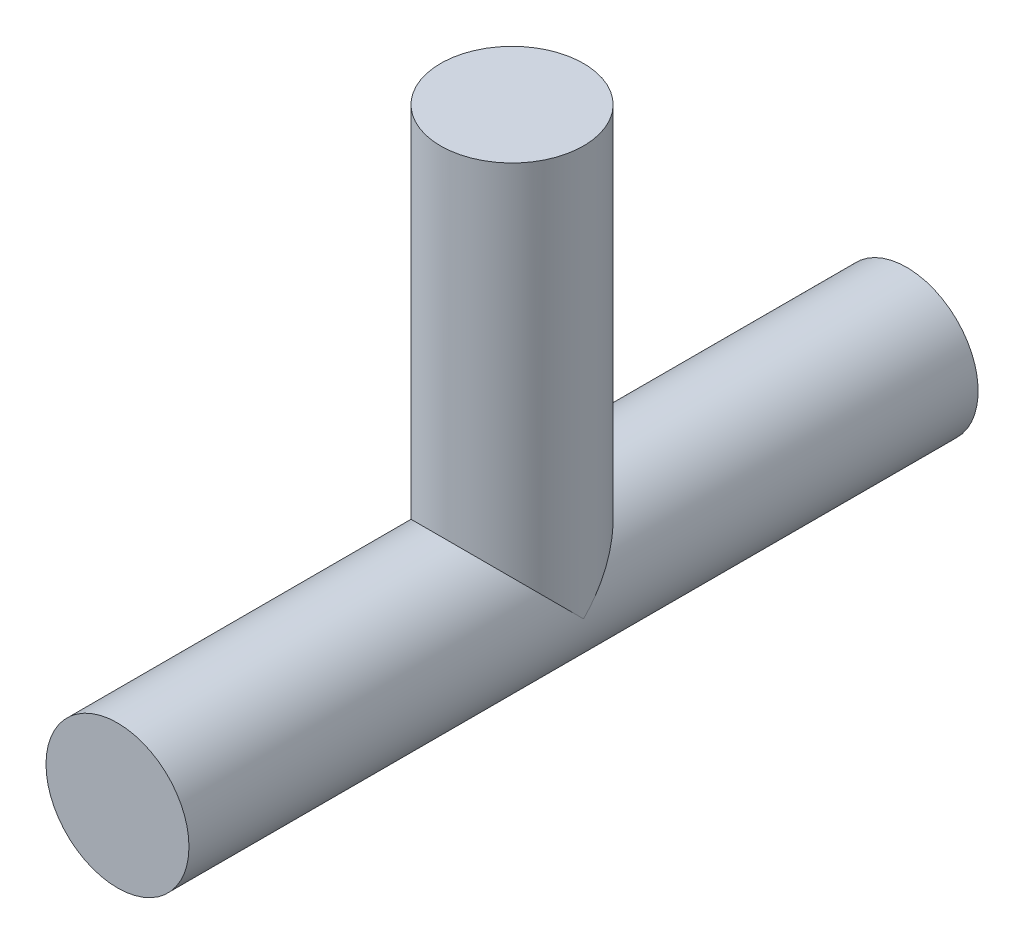
ISO-10303-21;
HEADER;
FILE_DESCRIPTION(('STEP AP214'),'2;1');
FILE_NAME('part.step','',(''),(''),'','','');
FILE_SCHEMA(('AUTOMOTIVE_DESIGN { 1 0 10303 214 1 1 1 1 }'));
ENDSEC;
DATA;
#1=APPLICATION_CONTEXT('core data for automotive mechanical design processes');
#2=APPLICATION_PROTOCOL_DEFINITION('international standard','automotive_design',2000,#1);
#3=PRODUCT_CONTEXT('',#1,'mechanical');
#4=PRODUCT('Part','Part','',(#3));
#5=PRODUCT_RELATED_PRODUCT_CATEGORY('part','',(#4));
#6=PRODUCT_DEFINITION_FORMATION('','',#4);
#7=PRODUCT_DEFINITION_CONTEXT('part definition',#1,'design');
#8=PRODUCT_DEFINITION('design','',#6,#7);
#9=PRODUCT_DEFINITION_SHAPE('','',#8);
#10=(LENGTH_UNIT() NAMED_UNIT(*) SI_UNIT(.MILLI.,.METRE.));
#11=(NAMED_UNIT(*) PLANE_ANGLE_UNIT() SI_UNIT($,.RADIAN.));
#12=(NAMED_UNIT(*) SI_UNIT($,.STERADIAN.) SOLID_ANGLE_UNIT());
#13=UNCERTAINTY_MEASURE_WITH_UNIT(LENGTH_MEASURE(1.E-05),#10,'distance_accuracy_value','');
#14=(GEOMETRIC_REPRESENTATION_CONTEXT(3) GLOBAL_UNCERTAINTY_ASSIGNED_CONTEXT((#13)) GLOBAL_UNIT_ASSIGNED_CONTEXT((#10,
#11,#12)) REPRESENTATION_CONTEXT('',''));
#15=CARTESIAN_POINT('',(0.,0.,0.));
#16=DIRECTION('',(0.,0.,1.));
#17=DIRECTION('',(1.,0.,0.));
#18=AXIS2_PLACEMENT_3D('',#15,#16,#17);
#19=CARTESIAN_POINT('',(-1.19117193968114E-06,55.0773866766543,2.03268499893037E-07));
#20=DIRECTION('',(0.,1.,0.));
#21=DIRECTION('',(0.,0.,1.));
#22=AXIS2_PLACEMENT_3D('',#19,#20,#21);
#23=PLANE('',#22);
#24=CARTESIAN_POINT('',(-1.19117193968114E-06,55.0773866766543,2.03268499893037E-07));
#25=DIRECTION('',(0.,1.,0.));
#26=DIRECTION('',(0.,0.,1.));
#27=AXIS2_PLACEMENT_3D('',#24,#25,#26);
#28=CIRCLE('',#27,9.625);
#29=CARTESIAN_POINT('',(-1.19117193968114E-06,55.0773866766543,9.6250002032685));
#30=VERTEX_POINT('',#29);
#31=EDGE_CURVE('E41',#30,#30,#28,.T.);
#32=ORIENTED_EDGE('',*,*,#31,.T.);
#33=EDGE_LOOP('',(#32));
#34=FACE_BOUND('',#33,.T.);
#35=ADVANCED_FACE('F38',(#34),#23,.T.);
#36=CARTESIAN_POINT('',(-1.19117193968114E-06,-0.0726133233457455,-53.1299997967315));
#37=DIRECTION('',(0.,0.,-1.));
#38=DIRECTION('',(-1.,0.,0.));
#39=AXIS2_PLACEMENT_3D('',#36,#37,#38);
#40=PLANE('',#39);
#41=CARTESIAN_POINT('',(-1.19117193968114E-06,-0.0726133233457455,-53.1299997967315));
#42=DIRECTION('',(0.,0.,-1.));
#43=DIRECTION('',(-1.,0.,0.));
#44=AXIS2_PLACEMENT_3D('',#41,#42,#43);
#45=CIRCLE('',#44,9.625);
#46=CARTESIAN_POINT('',(-9.62500119117194,-0.0726133233457455,-53.1299997967315));
#47=VERTEX_POINT('',#46);
#48=EDGE_CURVE('E67',#47,#47,#45,.T.);
#49=ORIENTED_EDGE('',*,*,#48,.T.);
#50=EDGE_LOOP('',(#49));
#51=FACE_BOUND('',#50,.T.);
#52=ADVANCED_FACE('F62',(#51),#40,.T.);
#53=CARTESIAN_POINT('',(-1.19117193968114E-06,-15.2236233233457,2.03268499893037E-07));
#54=DIRECTION('',(0.,1.,0.));
#55=DIRECTION('',(0.,0.,1.));
#56=AXIS2_PLACEMENT_3D('',#53,#54,#55);
#57=CYLINDRICAL_SURFACE('',#56,9.625);
#58=CARTESIAN_POINT('',(-1.19117193968114E-06,-0.0726133233457454,2.0326849957391E-07));
#59=DIRECTION('',(0.,0.707106781186547,-0.707106781186547));
#60=DIRECTION('',(0.,-0.707106781186547,-0.707106781186547));
#61=AXIS2_PLACEMENT_3D('',#58,#59,#60);
#62=ELLIPSE('',#61,13.611805537841,9.625);
#63=CARTESIAN_POINT('',(9.62499880882806,-0.0726133233457452,2.03268500482398E-07));
#64=VERTEX_POINT('',#63);
#65=CARTESIAN_POINT('',(-9.62500119117194,-0.0726133233457455,2.03268499254783E-07));
#66=VERTEX_POINT('',#65);
#67=EDGE_CURVE('E47',#64,#66,#62,.F.);
#68=ORIENTED_EDGE('',*,*,#67,.F.);
#69=CARTESIAN_POINT('',(-1.19117193968114E-06,-0.0726133233457454,2.0326849957391E-07));
#70=DIRECTION('',(0.,-0.707106781186547,-0.707106781186547));
#71=DIRECTION('',(0.,0.707106781186547,-0.707106781186547));
#72=AXIS2_PLACEMENT_3D('',#69,#70,#71);
#73=ELLIPSE('',#72,13.611805537841,9.625);
#74=EDGE_CURVE('E12',#66,#64,#73,.T.);
#75=ORIENTED_EDGE('',*,*,#74,.F.);
#76=EDGE_LOOP('',(#68,#75));
#77=FACE_BOUND('',#76,.T.);
#78=ORIENTED_EDGE('',*,*,#31,.F.);
#79=EDGE_LOOP('',(#78));
#80=FACE_BOUND('',#79,.T.);
#81=ADVANCED_FACE('F58',(#77,#80),#57,.T.);
#82=CARTESIAN_POINT('',(-1.19117193968114E-06,-0.0726133233457455,53.1300002032685));
#83=DIRECTION('',(0.,0.,1.));
#84=DIRECTION('',(1.,0.,0.));
#85=AXIS2_PLACEMENT_3D('',#82,#83,#84);
#86=PLANE('',#85);
#87=CARTESIAN_POINT('',(-1.19117193968114E-06,-0.0726133233457455,53.1300002032685));
#88=DIRECTION('',(0.,0.,1.));
#89=DIRECTION('',(1.,0.,0.));
#90=AXIS2_PLACEMENT_3D('',#87,#88,#89);
#91=CIRCLE('',#90,9.625);
#92=CARTESIAN_POINT('',(9.62499880882806,-0.0726133233457455,53.1300002032685));
#93=VERTEX_POINT('',#92);
#94=EDGE_CURVE('E56',#93,#93,#91,.T.);
#95=ORIENTED_EDGE('',*,*,#94,.T.);
#96=EDGE_LOOP('',(#95));
#97=FACE_BOUND('',#96,.T.);
#98=ADVANCED_FACE('F61',(#97),#86,.T.);
#99=CARTESIAN_POINT('',(-1.19117193968114E-06,-0.0726133233457455,53.3300002032685));
#100=DIRECTION('',(0.,0.,-1.));
#101=DIRECTION('',(-1.,0.,0.));
#102=AXIS2_PLACEMENT_3D('',#99,#100,#101);
#103=CYLINDRICAL_SURFACE('',#102,9.625);
#104=ORIENTED_EDGE('',*,*,#94,.F.);
#105=EDGE_LOOP('',(#104));
#106=FACE_BOUND('',#105,.T.);
#107=ORIENTED_EDGE('',*,*,#67,.T.);
#108=ORIENTED_EDGE('',*,*,#74,.T.);
#109=EDGE_LOOP('',(#107,#108));
#110=FACE_BOUND('',#109,.T.);
#111=ORIENTED_EDGE('',*,*,#48,.F.);
#112=EDGE_LOOP('',(#111));
#113=FACE_BOUND('',#112,.T.);
#114=ADVANCED_FACE('F53',(#106,#110,#113),#103,.T.);
#115=CLOSED_SHELL('',(#35,#52,#81,#98,#114));
#116=MANIFOLD_SOLID_BREP('B2',#115);
#117=ADVANCED_BREP_SHAPE_REPRESENTATION('',(#18,#116),#14);
#118=SHAPE_DEFINITION_REPRESENTATION(#9,#117);
ENDSEC;
END-ISO-10303-21;
